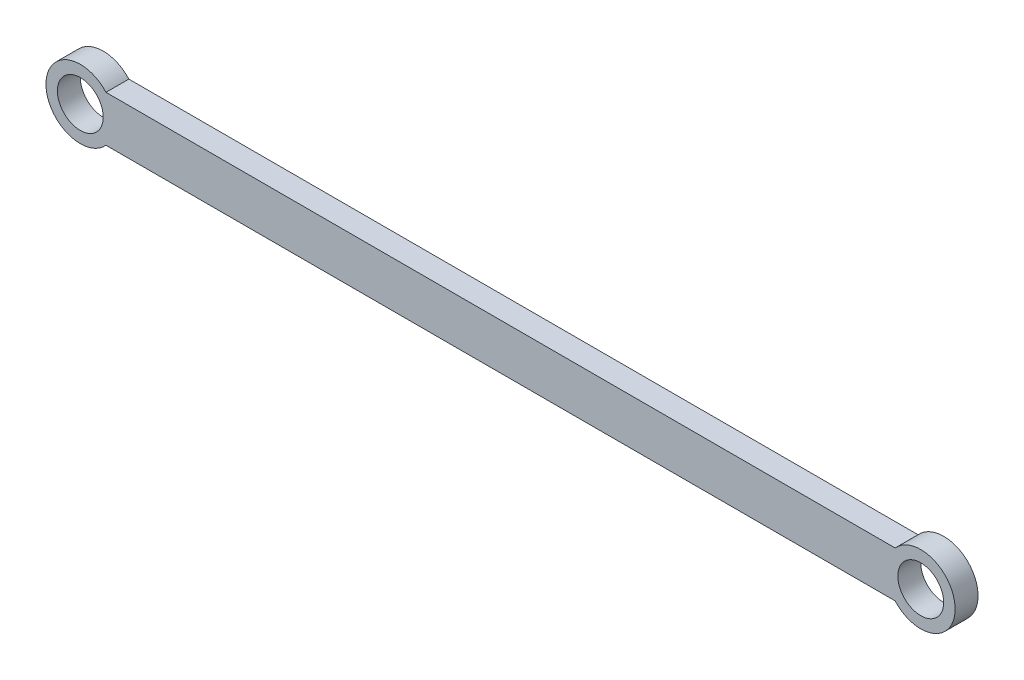
ISO-10303-21;
HEADER;
FILE_DESCRIPTION(('STEP AP214'),'2;1');
FILE_NAME('part.step','',(''),(''),'','','');
FILE_SCHEMA(('AUTOMOTIVE_DESIGN { 1 0 10303 214 1 1 1 1 }'));
ENDSEC;
DATA;
#1=APPLICATION_CONTEXT('core data for automotive mechanical design processes');
#2=APPLICATION_PROTOCOL_DEFINITION('international standard','automotive_design',2000,#1);
#3=PRODUCT_CONTEXT('',#1,'mechanical');
#4=PRODUCT('Part','Part','',(#3));
#5=PRODUCT_RELATED_PRODUCT_CATEGORY('part','',(#4));
#6=PRODUCT_DEFINITION_FORMATION('','',#4);
#7=PRODUCT_DEFINITION_CONTEXT('part definition',#1,'design');
#8=PRODUCT_DEFINITION('design','',#6,#7);
#9=PRODUCT_DEFINITION_SHAPE('','',#8);
#10=(LENGTH_UNIT() NAMED_UNIT(*) SI_UNIT(.MILLI.,.METRE.));
#11=(NAMED_UNIT(*) PLANE_ANGLE_UNIT() SI_UNIT($,.RADIAN.));
#12=(NAMED_UNIT(*) SI_UNIT($,.STERADIAN.) SOLID_ANGLE_UNIT());
#13=UNCERTAINTY_MEASURE_WITH_UNIT(LENGTH_MEASURE(1.E-05),#10,'distance_accuracy_value','');
#14=(GEOMETRIC_REPRESENTATION_CONTEXT(3) GLOBAL_UNCERTAINTY_ASSIGNED_CONTEXT((#13)) GLOBAL_UNIT_ASSIGNED_CONTEXT((#10,
#11,#12)) REPRESENTATION_CONTEXT('',''));
#15=CARTESIAN_POINT('',(0.,0.,0.));
#16=DIRECTION('',(0.,0.,1.));
#17=DIRECTION('',(1.,0.,0.));
#18=AXIS2_PLACEMENT_3D('',#15,#16,#17);
#19=CARTESIAN_POINT('',(0.,0.,3.));
#20=DIRECTION('',(0.,0.,1.));
#21=DIRECTION('',(1.,0.,0.));
#22=AXIS2_PLACEMENT_3D('',#19,#20,#21);
#23=PLANE('',#22);
#24=CARTESIAN_POINT('',(0.,0.,3.));
#25=DIRECTION('',(0.,0.,1.));
#26=DIRECTION('',(1.,0.,0.));
#27=AXIS2_PLACEMENT_3D('',#24,#25,#26);
#28=CIRCLE('',#27,3.);
#29=CARTESIAN_POINT('',(3.,0.,3.));
#30=VERTEX_POINT('',#29);
#31=EDGE_CURVE('E100',#30,#30,#28,.T.);
#32=ORIENTED_EDGE('',*,*,#31,.F.);
#33=EDGE_LOOP('',(#32));
#34=FACE_BOUND('',#33,.T.);
#35=CARTESIAN_POINT('',(0.,0.,3.));
#36=DIRECTION('',(0.,0.,1.));
#37=DIRECTION('',(1.,0.,0.));
#38=AXIS2_PLACEMENT_3D('',#35,#36,#37);
#39=CIRCLE('',#38,4.5);
#40=CARTESIAN_POINT('',(-3.35410196624968,-3.,3.));
#41=VERTEX_POINT('',#40);
#42=CARTESIAN_POINT('',(-3.35410196624968,3.,3.));
#43=VERTEX_POINT('',#42);
#44=EDGE_CURVE('E85',#41,#43,#39,.T.);
#45=ORIENTED_EDGE('',*,*,#44,.T.);
#46=DIRECTION('',(-1.,0.,0.));
#47=VECTOR('',#46,1.);
#48=CARTESIAN_POINT('',(-3.35410196624968,3.,3.));
#49=LINE('',#48,#47);
#50=CARTESIAN_POINT('',(-106.64589803375,2.99999999999999,3.));
#51=VERTEX_POINT('',#50);
#52=EDGE_CURVE('E80',#43,#51,#49,.T.);
#53=ORIENTED_EDGE('',*,*,#52,.T.);
#54=CARTESIAN_POINT('',(-110.,0.,3.));
#55=DIRECTION('',(0.,0.,1.));
#56=DIRECTION('',(1.,0.,0.));
#57=AXIS2_PLACEMENT_3D('',#54,#55,#56);
#58=CIRCLE('',#57,4.5);
#59=CARTESIAN_POINT('',(-106.64589803375,-3.00000000000001,3.));
#60=VERTEX_POINT('',#59);
#61=EDGE_CURVE('E83',#51,#60,#58,.T.);
#62=ORIENTED_EDGE('',*,*,#61,.T.);
#63=DIRECTION('',(1.,0.,0.));
#64=VECTOR('',#63,1.);
#65=CARTESIAN_POINT('',(-3.35410196624968,-3.,3.));
#66=LINE('',#65,#64);
#67=EDGE_CURVE('E50',#60,#41,#66,.T.);
#68=ORIENTED_EDGE('',*,*,#67,.T.);
#69=EDGE_LOOP('',(#45,#53,#62,#68));
#70=FACE_BOUND('',#69,.T.);
#71=CARTESIAN_POINT('',(-110.,0.,3.));
#72=DIRECTION('',(0.,0.,1.));
#73=DIRECTION('',(1.,0.,0.));
#74=AXIS2_PLACEMENT_3D('',#71,#72,#73);
#75=CIRCLE('',#74,2.99999999999999);
#76=CARTESIAN_POINT('',(-107.,0.,3.));
#77=VERTEX_POINT('',#76);
#78=EDGE_CURVE('E115',#77,#77,#75,.T.);
#79=ORIENTED_EDGE('',*,*,#78,.F.);
#80=EDGE_LOOP('',(#79));
#81=FACE_BOUND('',#80,.T.);
#82=ADVANCED_FACE('F33',(#34,#70,#81),#23,.T.);
#83=CARTESIAN_POINT('',(0.,0.,0.));
#84=DIRECTION('',(0.,0.,1.));
#85=DIRECTION('',(1.,0.,0.));
#86=AXIS2_PLACEMENT_3D('',#83,#84,#85);
#87=PLANE('',#86);
#88=CARTESIAN_POINT('',(0.,0.,0.));
#89=DIRECTION('',(0.,0.,1.));
#90=DIRECTION('',(1.,0.,0.));
#91=AXIS2_PLACEMENT_3D('',#88,#89,#90);
#92=CIRCLE('',#91,3.);
#93=CARTESIAN_POINT('',(3.,0.,0.));
#94=VERTEX_POINT('',#93);
#95=EDGE_CURVE('E112',#94,#94,#92,.T.);
#96=ORIENTED_EDGE('',*,*,#95,.T.);
#97=EDGE_LOOP('',(#96));
#98=FACE_BOUND('',#97,.T.);
#99=CARTESIAN_POINT('',(0.,0.,0.));
#100=DIRECTION('',(0.,0.,1.));
#101=DIRECTION('',(1.,0.,0.));
#102=AXIS2_PLACEMENT_3D('',#99,#100,#101);
#103=CIRCLE('',#102,4.5);
#104=CARTESIAN_POINT('',(-3.35410196624968,-3.,0.));
#105=VERTEX_POINT('',#104);
#106=CARTESIAN_POINT('',(-3.35410196624968,3.,0.));
#107=VERTEX_POINT('',#106);
#108=EDGE_CURVE('E97',#105,#107,#103,.T.);
#109=ORIENTED_EDGE('',*,*,#108,.F.);
#110=DIRECTION('',(1.,0.,0.));
#111=VECTOR('',#110,1.);
#112=CARTESIAN_POINT('',(-3.35410196624968,-3.,0.));
#113=LINE('',#112,#111);
#114=CARTESIAN_POINT('',(-106.64589803375,-3.00000000000001,0.));
#115=VERTEX_POINT('',#114);
#116=EDGE_CURVE('E73',#115,#105,#113,.T.);
#117=ORIENTED_EDGE('',*,*,#116,.F.);
#118=CARTESIAN_POINT('',(-110.,0.,0.));
#119=DIRECTION('',(0.,0.,1.));
#120=DIRECTION('',(1.,0.,0.));
#121=AXIS2_PLACEMENT_3D('',#118,#119,#120);
#122=CIRCLE('',#121,4.5);
#123=CARTESIAN_POINT('',(-106.64589803375,2.99999999999999,0.));
#124=VERTEX_POINT('',#123);
#125=EDGE_CURVE('E67',#124,#115,#122,.T.);
#126=ORIENTED_EDGE('',*,*,#125,.F.);
#127=DIRECTION('',(-1.,0.,0.));
#128=VECTOR('',#127,1.);
#129=CARTESIAN_POINT('',(-3.35410196624968,3.,0.));
#130=LINE('',#129,#128);
#131=EDGE_CURVE('E89',#107,#124,#130,.T.);
#132=ORIENTED_EDGE('',*,*,#131,.F.);
#133=EDGE_LOOP('',(#109,#117,#126,#132));
#134=FACE_BOUND('',#133,.T.);
#135=CARTESIAN_POINT('',(-110.,0.,0.));
#136=DIRECTION('',(0.,0.,1.));
#137=DIRECTION('',(1.,0.,0.));
#138=AXIS2_PLACEMENT_3D('',#135,#136,#137);
#139=CIRCLE('',#138,2.99999999999999);
#140=CARTESIAN_POINT('',(-107.,0.,0.));
#141=VERTEX_POINT('',#140);
#142=EDGE_CURVE('E118',#141,#141,#139,.T.);
#143=ORIENTED_EDGE('',*,*,#142,.T.);
#144=EDGE_LOOP('',(#143));
#145=FACE_BOUND('',#144,.T.);
#146=ADVANCED_FACE('F108',(#98,#134,#145),#87,.F.);
#147=CARTESIAN_POINT('',(0.,0.,3.));
#148=DIRECTION('',(0.,0.,-1.));
#149=DIRECTION('',(-1.,0.,0.));
#150=AXIS2_PLACEMENT_3D('',#147,#148,#149);
#151=CYLINDRICAL_SURFACE('',#150,4.5);
#152=ORIENTED_EDGE('',*,*,#108,.T.);
#153=DIRECTION('',(0.,0.,-1.));
#154=VECTOR('',#153,1.);
#155=CARTESIAN_POINT('',(-3.35410196624968,3.,3.));
#156=LINE('',#155,#154);
#157=EDGE_CURVE('E11',#43,#107,#156,.T.);
#158=ORIENTED_EDGE('',*,*,#157,.F.);
#159=ORIENTED_EDGE('',*,*,#44,.F.);
#160=DIRECTION('',(0.,0.,-1.));
#161=VECTOR('',#160,1.);
#162=CARTESIAN_POINT('',(-3.35410196624968,-3.,3.));
#163=LINE('',#162,#161);
#164=EDGE_CURVE('E93',#41,#105,#163,.T.);
#165=ORIENTED_EDGE('',*,*,#164,.T.);
#166=EDGE_LOOP('',(#152,#158,#159,#165));
#167=FACE_BOUND('',#166,.T.);
#168=ADVANCED_FACE('F35',(#167),#151,.T.);
#169=CARTESIAN_POINT('',(-3.35410196624968,3.,3.));
#170=DIRECTION('',(0.,-1.,0.));
#171=DIRECTION('',(1.,0.,0.));
#172=AXIS2_PLACEMENT_3D('',#169,#170,#171);
#173=PLANE('',#172);
#174=ORIENTED_EDGE('',*,*,#131,.T.);
#175=DIRECTION('',(0.,0.,-1.));
#176=VECTOR('',#175,1.);
#177=CARTESIAN_POINT('',(-106.64589803375,2.99999999999999,3.));
#178=LINE('',#177,#176);
#179=EDGE_CURVE('E42',#51,#124,#178,.T.);
#180=ORIENTED_EDGE('',*,*,#179,.F.);
#181=ORIENTED_EDGE('',*,*,#52,.F.);
#182=ORIENTED_EDGE('',*,*,#157,.T.);
#183=EDGE_LOOP('',(#174,#180,#181,#182));
#184=FACE_BOUND('',#183,.T.);
#185=ADVANCED_FACE('F88',(#184),#173,.F.);
#186=CARTESIAN_POINT('',(-110.,0.,3.));
#187=DIRECTION('',(0.,0.,-1.));
#188=DIRECTION('',(-1.,0.,0.));
#189=AXIS2_PLACEMENT_3D('',#186,#187,#188);
#190=CYLINDRICAL_SURFACE('',#189,4.5);
#191=ORIENTED_EDGE('',*,*,#125,.T.);
#192=DIRECTION('',(0.,0.,-1.));
#193=VECTOR('',#192,1.);
#194=CARTESIAN_POINT('',(-106.64589803375,-3.00000000000001,3.));
#195=LINE('',#194,#193);
#196=EDGE_CURVE('E90',#60,#115,#195,.T.);
#197=ORIENTED_EDGE('',*,*,#196,.F.);
#198=ORIENTED_EDGE('',*,*,#61,.F.);
#199=ORIENTED_EDGE('',*,*,#179,.T.);
#200=EDGE_LOOP('',(#191,#197,#198,#199));
#201=FACE_BOUND('',#200,.T.);
#202=ADVANCED_FACE('F91',(#201),#190,.T.);
#203=CARTESIAN_POINT('',(-3.35410196624968,-3.,3.));
#204=DIRECTION('',(0.,1.,0.));
#205=DIRECTION('',(-1.,0.,0.));
#206=AXIS2_PLACEMENT_3D('',#203,#204,#205);
#207=PLANE('',#206);
#208=ORIENTED_EDGE('',*,*,#116,.T.);
#209=ORIENTED_EDGE('',*,*,#164,.F.);
#210=ORIENTED_EDGE('',*,*,#67,.F.);
#211=ORIENTED_EDGE('',*,*,#196,.T.);
#212=EDGE_LOOP('',(#208,#209,#210,#211));
#213=FACE_BOUND('',#212,.T.);
#214=ADVANCED_FACE('F105',(#213),#207,.F.);
#215=CARTESIAN_POINT('',(0.,0.,3.));
#216=DIRECTION('',(0.,0.,-1.));
#217=DIRECTION('',(-1.,0.,0.));
#218=AXIS2_PLACEMENT_3D('',#215,#216,#217);
#219=CYLINDRICAL_SURFACE('',#218,3.);
#220=ORIENTED_EDGE('',*,*,#31,.T.);
#221=EDGE_LOOP('',(#220));
#222=FACE_BOUND('',#221,.T.);
#223=ORIENTED_EDGE('',*,*,#95,.F.);
#224=EDGE_LOOP('',(#223));
#225=FACE_BOUND('',#224,.T.);
#226=ADVANCED_FACE('F136',(#222,#225),#219,.F.);
#227=CARTESIAN_POINT('',(-110.,0.,3.));
#228=DIRECTION('',(0.,0.,-1.));
#229=DIRECTION('',(-1.,0.,0.));
#230=AXIS2_PLACEMENT_3D('',#227,#228,#229);
#231=CYLINDRICAL_SURFACE('',#230,2.99999999999999);
#232=ORIENTED_EDGE('',*,*,#78,.T.);
#233=EDGE_LOOP('',(#232));
#234=FACE_BOUND('',#233,.T.);
#235=ORIENTED_EDGE('',*,*,#142,.F.);
#236=EDGE_LOOP('',(#235));
#237=FACE_BOUND('',#236,.T.);
#238=ADVANCED_FACE('F124',(#234,#237),#231,.F.);
#239=CLOSED_SHELL('',(#82,#146,#168,#185,#202,#214,#226,#238));
#240=MANIFOLD_SOLID_BREP('B2',#239);
#241=ADVANCED_BREP_SHAPE_REPRESENTATION('',(#18,#240),#14);
#242=SHAPE_DEFINITION_REPRESENTATION(#9,#241);
ENDSEC;
END-ISO-10303-21;
